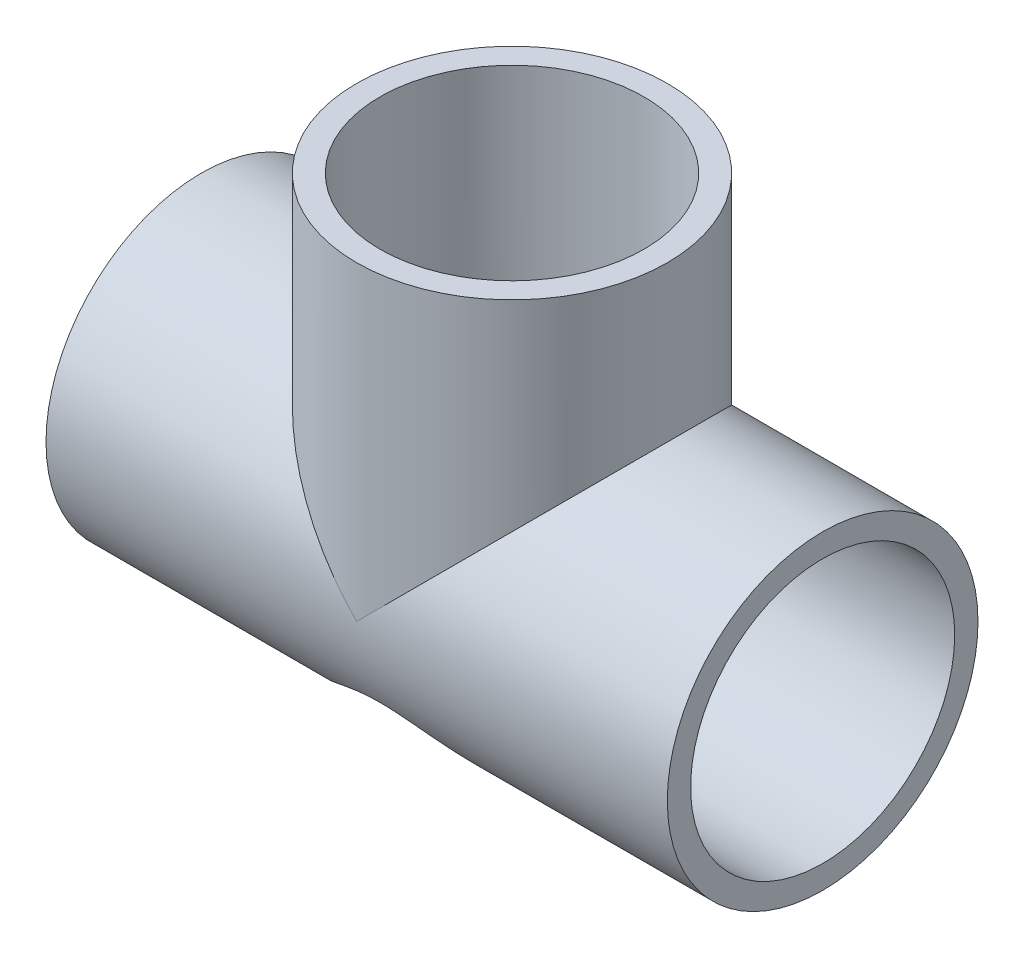
ISO-10303-21;
HEADER;
FILE_DESCRIPTION(('STEP AP214'),'2;1');
FILE_NAME('part.step','',(''),(''),'','','');
FILE_SCHEMA(('AUTOMOTIVE_DESIGN { 1 0 10303 214 1 1 1 1 }'));
ENDSEC;
DATA;
#1=APPLICATION_CONTEXT('core data for automotive mechanical design processes');
#2=APPLICATION_PROTOCOL_DEFINITION('international standard','automotive_design',2000,#1);
#3=PRODUCT_CONTEXT('',#1,'mechanical');
#4=PRODUCT('Part','Part','',(#3));
#5=PRODUCT_RELATED_PRODUCT_CATEGORY('part','',(#4));
#6=PRODUCT_DEFINITION_FORMATION('','',#4);
#7=PRODUCT_DEFINITION_CONTEXT('part definition',#1,'design');
#8=PRODUCT_DEFINITION('design','',#6,#7);
#9=PRODUCT_DEFINITION_SHAPE('','',#8);
#10=(LENGTH_UNIT() NAMED_UNIT(*) SI_UNIT(.MILLI.,.METRE.));
#11=(NAMED_UNIT(*) PLANE_ANGLE_UNIT() SI_UNIT($,.RADIAN.));
#12=(NAMED_UNIT(*) SI_UNIT($,.STERADIAN.) SOLID_ANGLE_UNIT());
#13=UNCERTAINTY_MEASURE_WITH_UNIT(LENGTH_MEASURE(1.E-05),#10,'distance_accuracy_value','');
#14=(GEOMETRIC_REPRESENTATION_CONTEXT(3) GLOBAL_UNCERTAINTY_ASSIGNED_CONTEXT((#13)) GLOBAL_UNIT_ASSIGNED_CONTEXT((#10,
#11,#12)) REPRESENTATION_CONTEXT('',''));
#15=CARTESIAN_POINT('',(0.,0.,0.));
#16=DIRECTION('',(0.,0.,1.));
#17=DIRECTION('',(1.,0.,0.));
#18=AXIS2_PLACEMENT_3D('',#15,#16,#17);
#19=CARTESIAN_POINT('',(50.,0.,0.));
#20=DIRECTION('',(-1.,0.,0.));
#21=DIRECTION('',(0.,0.,1.));
#22=AXIS2_PLACEMENT_3D('',#19,#20,#21);
#23=CYLINDRICAL_SURFACE('',#22,42.5);
#24=CARTESIAN_POINT('',(0.,0.,0.));
#25=DIRECTION('',(-0.707106781186547,0.707106781186547,0.));
#26=DIRECTION('',(-0.707106781186547,-0.707106781186547,0.));
#27=AXIS2_PLACEMENT_3D('',#24,#25,#26);
#28=ELLIPSE('',#27,60.1040764008565,42.5);
#29=CARTESIAN_POINT('',(0.,0.,-42.5));
#30=VERTEX_POINT('',#29);
#31=CARTESIAN_POINT('',(0.,0.,42.5));
#32=VERTEX_POINT('',#31);
#33=EDGE_CURVE('E65',#30,#32,#28,.F.);
#34=ORIENTED_EDGE('',*,*,#33,.F.);
#35=CARTESIAN_POINT('',(0.,0.,0.));
#36=DIRECTION('',(-0.707106781186547,-0.707106781186547,0.));
#37=DIRECTION('',(-0.707106781186547,0.707106781186547,0.));
#38=AXIS2_PLACEMENT_3D('',#35,#36,#37);
#39=ELLIPSE('',#38,60.1040764008565,42.5);
#40=EDGE_CURVE('E87',#32,#30,#39,.F.);
#41=ORIENTED_EDGE('',*,*,#40,.F.);
#42=EDGE_LOOP('',(#34,#41));
#43=FACE_BOUND('',#42,.T.);
#44=CARTESIAN_POINT('',(100.,0.,0.));
#45=DIRECTION('',(1.,0.,0.));
#46=DIRECTION('',(0.,0.,-1.));
#47=AXIS2_PLACEMENT_3D('',#44,#45,#46);
#48=CIRCLE('',#47,42.5);
#49=CARTESIAN_POINT('',(100.,0.,-42.5));
#50=VERTEX_POINT('',#49);
#51=EDGE_CURVE('E108',#50,#50,#48,.T.);
#52=ORIENTED_EDGE('',*,*,#51,.T.);
#53=EDGE_LOOP('',(#52));
#54=FACE_BOUND('',#53,.T.);
#55=ADVANCED_FACE('F44',(#43,#54),#23,.F.);
#56=CARTESIAN_POINT('',(100.,0.,0.));
#57=DIRECTION('',(1.,0.,0.));
#58=DIRECTION('',(0.,0.,-1.));
#59=AXIS2_PLACEMENT_3D('',#56,#57,#58);
#60=PLANE('',#59);
#61=CARTESIAN_POINT('',(100.,0.,0.));
#62=DIRECTION('',(1.,0.,0.));
#63=DIRECTION('',(0.,0.,-1.));
#64=AXIS2_PLACEMENT_3D('',#61,#62,#63);
#65=CIRCLE('',#64,50.);
#66=CARTESIAN_POINT('',(100.,0.,-50.));
#67=VERTEX_POINT('',#66);
#68=EDGE_CURVE('E12',#67,#67,#65,.T.);
#69=ORIENTED_EDGE('',*,*,#68,.T.);
#70=EDGE_LOOP('',(#69));
#71=FACE_BOUND('',#70,.T.);
#72=ORIENTED_EDGE('',*,*,#51,.F.);
#73=EDGE_LOOP('',(#72));
#74=FACE_BOUND('',#73,.T.);
#75=ADVANCED_FACE('F124',(#71,#74),#60,.T.);
#76=CARTESIAN_POINT('',(0.,0.,0.));
#77=DIRECTION('',(-0.707106781186547,-0.707106781186547,0.));
#78=DIRECTION('',(-0.707106781186547,0.707106781186547,0.));
#79=AXIS2_PLACEMENT_3D('',#76,#77,#78);
#80=ELLIPSE('',#79,60.1040764008565,42.5);
#81=EDGE_CURVE('E77',#32,#30,#80,.T.);
#82=ORIENTED_EDGE('',*,*,#81,.F.);
#83=CARTESIAN_POINT('',(0.,0.,0.));
#84=DIRECTION('',(-0.707106781186547,0.707106781186547,0.));
#85=DIRECTION('',(-0.707106781186547,-0.707106781186547,0.));
#86=AXIS2_PLACEMENT_3D('',#83,#84,#85);
#87=ELLIPSE('',#86,60.1040764008565,42.5);
#88=EDGE_CURVE('E92',#30,#32,#87,.T.);
#89=ORIENTED_EDGE('',*,*,#88,.F.);
#90=EDGE_LOOP('',(#82,#89));
#91=FACE_BOUND('',#90,.T.);
#92=CARTESIAN_POINT('',(-100.,0.,0.));
#93=DIRECTION('',(1.,0.,0.));
#94=DIRECTION('',(0.,0.,-1.));
#95=AXIS2_PLACEMENT_3D('',#92,#93,#94);
#96=CIRCLE('',#95,42.5);
#97=CARTESIAN_POINT('',(-100.,0.,-42.5));
#98=VERTEX_POINT('',#97);
#99=EDGE_CURVE('E107',#98,#98,#96,.T.);
#100=ORIENTED_EDGE('',*,*,#99,.F.);
#101=EDGE_LOOP('',(#100));
#102=FACE_BOUND('',#101,.T.);
#103=ADVANCED_FACE('F94',(#91,#102),#23,.F.);
#104=CARTESIAN_POINT('',(50.,0.,0.));
#105=DIRECTION('',(-1.,0.,0.));
#106=DIRECTION('',(0.,0.,1.));
#107=AXIS2_PLACEMENT_3D('',#104,#105,#106);
#108=CYLINDRICAL_SURFACE('',#107,50.);
#109=CARTESIAN_POINT('',(0.,-26.3391343821318,42.5));
#110=CARTESIAN_POINT('',(0.725211898185081,-26.3391567870329,42.49999202719));
#111=CARTESIAN_POINT('',(1.45065802858549,-26.369250982345,42.481381140812));
#112=CARTESIAN_POINT('',(2.89514111491192,-26.4879715036844,42.4074522279962));
#113=CARTESIAN_POINT('',(3.61417335527075,-26.5766377906554,42.3521091408081));
#114=CARTESIAN_POINT('',(5.04194475430984,-26.8080826373791,42.2059870066493));
#115=CARTESIAN_POINT('',(5.75064667521772,-26.951022322171,42.1151024209827));
#116=CARTESIAN_POINT('',(7.15144524385325,-27.2842427356274,41.8999916045213));
#117=CARTESIAN_POINT('',(7.84354184378451,-27.4745236005398,41.7757652777691));
#118=CARTESIAN_POINT('',(9.4881701775968,-27.9810219082791,41.4389745473066));
#119=CARTESIAN_POINT('',(10.431496995776,-28.316922062192,41.2110583301054));
#120=CARTESIAN_POINT('',(12.2789247409494,-29.0482525141808,40.6988723609985));
#121=CARTESIAN_POINT('',(13.1830035898208,-29.4437157732638,40.4145713791465));
#122=CARTESIAN_POINT('',(14.9549125892595,-30.2784938574265,39.7930197782754));
#123=CARTESIAN_POINT('',(15.8226361338149,-30.7179263695507,39.4556255918315));
#124=CARTESIAN_POINT('',(17.5209659427935,-31.6262457688377,38.7313567044281));
#125=CARTESIAN_POINT('',(18.3515745512784,-32.0951307913611,38.3444851342802));
#126=CARTESIAN_POINT('',(19.7730147087391,-32.9314529376963,37.6263533230709));
#127=CARTESIAN_POINT('',(20.3716279955444,-33.2947580077124,37.3055650933665));
#128=CARTESIAN_POINT('',(21.5496984303852,-34.028325769708,36.637672533246));
#129=CARTESIAN_POINT('',(22.1291538997985,-34.3985890669379,36.2905659055217));
#130=CARTESIAN_POINT('',(23.2694311912268,-35.142992222961,35.5701916175696));
#131=CARTESIAN_POINT('',(23.8302449680472,-35.5171336663673,35.1969128728891));
#132=CARTESIAN_POINT('',(24.9330930474468,-36.2663124365689,34.424469371275));
#133=CARTESIAN_POINT('',(25.4751279147959,-36.6413497360585,34.0253053938706));
#134=CARTESIAN_POINT('',(26.5398454748341,-37.3894374851881,33.2014939035382));
#135=CARTESIAN_POINT('',(27.062546142398,-37.7624894893867,32.7768710740929));
#136=CARTESIAN_POINT('',(28.0887639575677,-38.5045873246054,31.9018193444586));
#137=CARTESIAN_POINT('',(28.592280716354,-38.8736330743184,31.4513899216842));
#138=CARTESIAN_POINT('',(30.072962154608,-39.971149680218,30.0615927816757));
#139=CARTESIAN_POINT('',(31.0209379043143,-40.6904825615714,29.0831912165929));
#140=CARTESIAN_POINT('',(32.6324958609711,-41.9336241111924,27.2491360598047));
#141=CARTESIAN_POINT('',(33.3128286487028,-42.4656926210775,26.4136791370192));
#142=CARTESIAN_POINT('',(34.6168825161168,-43.4961922986432,24.6799050109747));
#143=CARTESIAN_POINT('',(35.2406055445616,-43.9946246240808,23.7815899734614));
#144=CARTESIAN_POINT('',(36.4248597940039,-44.9488345037011,21.9246577396795));
#145=CARTESIAN_POINT('',(36.9854746295884,-45.4046683589259,20.9661230199537));
#146=CARTESIAN_POINT('',(38.0377664584819,-46.2658650929625,18.9902694212451));
#147=CARTESIAN_POINT('',(38.5294565193346,-46.6712375371869,17.9729617368978));
#148=CARTESIAN_POINT('',(39.3556052405926,-47.3557838130623,16.0705163175456));
#149=CARTESIAN_POINT('',(39.7024628772922,-47.6445675362484,15.1942059761239));
#150=CARTESIAN_POINT('',(40.3405954387533,-48.1776177059569,13.4083955748443));
#151=CARTESIAN_POINT('',(40.6318762963514,-48.4218889040784,12.49889906998));
#152=CARTESIAN_POINT('',(41.1547400114881,-48.8614632538528,10.6516817677908));
#153=CARTESIAN_POINT('',(41.3863465421954,-49.0567858228807,9.71397232808962));
#154=CARTESIAN_POINT('',(41.7864145219108,-49.3947666434327,7.81576859904049));
#155=CARTESIAN_POINT('',(41.9548752575555,-49.5374242999966,6.85527405241763));
#156=CARTESIAN_POINT('',(42.2264003646234,-49.7675965456939,4.91387435973801));
#157=CARTESIAN_POINT('',(42.3291566876643,-49.8548513712102,3.93289501910159));
#158=CARTESIAN_POINT('',(42.4661376801712,-49.9712070851266,1.96270105527905));
#159=CARTESIAN_POINT('',(42.5003622039592,-50.0003078499085,0.973486414591638));
#160=CARTESIAN_POINT('',(42.4996320166524,-49.9996872376098,-1.00483120147058));
#161=CARTESIAN_POINT('',(42.4646816586565,-49.9699695619086,-1.99393417995504));
#162=CARTESIAN_POINT('',(42.3262693369479,-49.8523995280878,-3.96380274493936));
#163=CARTESIAN_POINT('',(42.2228101816942,-49.7645495530518,-4.94456867154023));
#164=CARTESIAN_POINT('',(41.9594490098244,-49.5413048921935,-6.81776511784512));
#165=CARTESIAN_POINT('',(41.8043021651976,-49.4099195871217,-7.71135236940262));
#166=CARTESIAN_POINT('',(41.4392383856868,-49.1014353088852,-9.47913792485673));
#167=CARTESIAN_POINT('',(41.229324780101,-48.9243391145146,-10.3533374038417));
#168=CARTESIAN_POINT('',(40.757565434374,-48.5274446914428,-12.0776642031425));
#169=CARTESIAN_POINT('',(40.4957174461572,-48.3076446142333,-12.9277904795843));
#170=CARTESIAN_POINT('',(39.923283784079,-47.8287988339707,-14.6000906802508));
#171=CARTESIAN_POINT('',(39.6126950729873,-47.5697506852473,-15.4222628586563));
#172=CARTESIAN_POINT('',(38.9197371240195,-46.9942101407361,-17.0994508872366));
#173=CARTESIAN_POINT('',(38.5336326593327,-46.6747942245017,-17.9519175680478));
#174=CARTESIAN_POINT('',(37.7127222306685,-45.9994019360847,-19.6179289314817));
#175=CARTESIAN_POINT('',(37.2779150077208,-45.6434246188068,-20.4314726071653));
#176=CARTESIAN_POINT('',(36.3632845260253,-44.899527998887,-22.0181885406348));
#177=CARTESIAN_POINT('',(35.8834371077212,-44.5115915671832,-22.7913387812874));
#178=CARTESIAN_POINT('',(34.8823696260805,-43.7085841448695,-24.2958207993424));
#179=CARTESIAN_POINT('',(34.361141269158,-43.2935077178054,-25.0271441429945));
#180=CARTESIAN_POINT('',(33.416642636474,-42.5483293645983,-26.268299050259));
#181=CARTESIAN_POINT('',(33.0017635065046,-42.2231551552569,-26.7875255652406));
#182=CARTESIAN_POINT('',(32.1518352665696,-41.5622339828823,-27.8019291575287));
#183=CARTESIAN_POINT('',(31.7167894430468,-41.2264887453858,-28.2971101266479));
#184=CARTESIAN_POINT('',(30.3822288043898,-40.2057187820271,-29.7472195534696));
#185=CARTESIAN_POINT('',(29.4535282533305,-39.5073484088781,-30.6664039595332));
#186=CARTESIAN_POINT('',(28.0061195868321,-38.4445805118311,-31.9739132484867));
#187=CARTESIAN_POINT('',(27.5140235862826,-38.0873910255745,-32.3982958551341));
#188=CARTESIAN_POINT('',(26.5121469727369,-37.3700612589591,-33.2231403888845));
#189=CARTESIAN_POINT('',(26.0023663224174,-37.0099209723737,-33.6236022654984));
#190=CARTESIAN_POINT('',(24.9655599357227,-36.2889842518412,-34.4004412261207));
#191=CARTESIAN_POINT('',(24.4385395152383,-35.9281880519559,-34.7768256305754));
#192=CARTESIAN_POINT('',(23.3671558350968,-35.2081915854682,-35.5055725362412));
#193=CARTESIAN_POINT('',(22.8227932949242,-34.8489912533595,-35.8579360321248));
#194=CARTESIAN_POINT('',(21.4165769994772,-33.9410418734411,-36.7230701149706));
#195=CARTESIAN_POINT('',(20.5425925982025,-33.3951035521651,-37.2192408040975));
#196=CARTESIAN_POINT('',(18.7513486999347,-32.3241008168695,-38.1530762449519));
#197=CARTESIAN_POINT('',(17.8340837751267,-31.7990390362752,-38.5907336319949));
#198=CARTESIAN_POINT('',(15.9562982362045,-30.7852234810835,-39.4042026688978));
#199=CARTESIAN_POINT('',(14.9958884669771,-30.2963843541066,-39.7801624165211));
#200=CARTESIAN_POINT('',(13.0275354827318,-29.3719681384752,-40.4675024172834));
#201=CARTESIAN_POINT('',(12.0196210805723,-28.9363593258776,-40.7789212130181));
#202=CARTESIAN_POINT('',(10.3439557145622,-28.2912580675237,-41.22737330008));
#203=CARTESIAN_POINT('',(9.69093604907316,-28.0583639961654,-41.3859286484039));
#204=CARTESIAN_POINT('',(8.36665907190421,-27.62894821709,-41.6738285056251));
#205=CARTESIAN_POINT('',(7.69540403217541,-27.4324220019082,-41.8031766349296));
#206=CARTESIAN_POINT('',(6.33785717484376,-27.0830108285203,-42.030394103654));
#207=CARTESIAN_POINT('',(5.65160105771351,-26.9300323092879,-42.128330987552));
#208=CARTESIAN_POINT('',(4.26590474000412,-26.6736701871987,-42.2911162907257));
#209=CARTESIAN_POINT('',(3.56646502208576,-26.5702847723552,-42.3559659189185));
#210=CARTESIAN_POINT('',(2.15242034465923,-26.4175025999415,-42.4514299444122));
#211=CARTESIAN_POINT('',(1.43773415717399,-26.3686370331601,-42.4817075697319));
#212=CARTESIAN_POINT('',(0.00615136623367753,-26.3294161130181,-42.5060279842829));
#213=CARTESIAN_POINT('',(-0.710745128930647,-26.3390579373119,-42.5000725213668));
#214=CARTESIAN_POINT('',(-2.14078153704913,-26.4163323437918,-42.452083402804));
#215=CARTESIAN_POINT('',(-2.85391754601739,-26.4840164468586,-42.4100176940802));
#216=CARTESIAN_POINT('',(-4.26992687958348,-26.6737596468692,-42.2909317734936));
#217=CARTESIAN_POINT('',(-4.97279848506087,-26.7958277467838,-42.2139057741078));
#218=CARTESIAN_POINT('',(-6.50427300430854,-27.1180324641161,-42.0078069029186));
#219=CARTESIAN_POINT('',(-7.32960393125462,-27.3289561895003,-41.8713648897852));
#220=CARTESIAN_POINT('',(-8.95438297941609,-27.8087643753638,-41.5542413155113));
#221=CARTESIAN_POINT('',(-9.75382342007044,-28.0776658573611,-41.3735467602768));
#222=CARTESIAN_POINT('',(-11.3272607134559,-28.6621975768578,-40.9707784725425));
#223=CARTESIAN_POINT('',(-12.101176405718,-28.9779620428063,-40.7485853881157));
#224=CARTESIAN_POINT('',(-13.6211933066007,-29.6449029811948,-40.2659793295917));
#225=CARTESIAN_POINT('',(-14.3672932256745,-29.9960810926316,-40.0055645862844));
#226=CARTESIAN_POINT('',(-15.7022016528223,-30.6600120979057,-39.4981770358435));
#227=CARTESIAN_POINT('',(-16.2953898171529,-30.9684949224438,-39.2570470093091));
#228=CARTESIAN_POINT('',(-17.4642494356835,-31.5991743843371,-38.7512010003305));
#229=CARTESIAN_POINT('',(-18.0399185764767,-31.9213728194945,-38.4864819208992));
#230=CARTESIAN_POINT('',(-19.1745162596745,-32.5760237183624,-37.9339724085412));
#231=CARTESIAN_POINT('',(-19.7334362426737,-32.9084812544515,-37.6461704466075));
#232=CARTESIAN_POINT('',(-20.8347009433216,-33.5804182306701,-37.0480478387521));
#233=CARTESIAN_POINT('',(-21.3770463073058,-33.9198973961199,-36.7377280725197));
#234=CARTESIAN_POINT('',(-22.446225341114,-34.6036688979488,-36.0944136137705));
#235=CARTESIAN_POINT('',(-22.9730384288131,-34.9479668012692,-35.7613906148613));
#236=CARTESIAN_POINT('',(-24.0106109926051,-35.6385992931125,-35.0731820671506));
#237=CARTESIAN_POINT('',(-24.5213690563353,-35.9849340576548,-34.7179945766947));
#238=CARTESIAN_POINT('',(-26.0293996788265,-37.0235990062251,-33.6194528522282));
#239=CARTESIAN_POINT('',(-27.0029078170545,-37.7159003146361,-32.842830833227));
#240=CARTESIAN_POINT('',(-28.4334051292401,-38.7568897319731,-31.5945274550086));
#241=CARTESIAN_POINT('',(-28.9145204914289,-39.1113848560584,-31.1548879493205));
#242=CARTESIAN_POINT('',(-29.8583289584808,-39.8141992878545,-30.2515625876018));
#243=CARTESIAN_POINT('',(-30.3210217473151,-40.1625184895642,-29.7878763193767));
#244=CARTESIAN_POINT('',(-31.6806815266242,-41.1954779794769,-28.3603858067069));
#245=CARTESIAN_POINT('',(-32.5492644709392,-41.868145494396,-27.3601198047385));
#246=CARTESIAN_POINT('',(-33.7875812708191,-42.8402380603986,-25.7893875371749));
#247=CARTESIAN_POINT('',(-34.1891734747019,-43.1577769991543,-25.2547361988159));
#248=CARTESIAN_POINT('',(-34.9701812839122,-43.7790756620893,-24.1616947668411));
#249=CARTESIAN_POINT('',(-35.3495982336187,-44.082836221335,-23.603306115857));
#250=CARTESIAN_POINT('',(-36.08466029059,-44.6744355417493,-22.46345749169));
#251=CARTESIAN_POINT('',(-36.4403186514039,-44.9622831641108,-21.8820106747706));
#252=CARTESIAN_POINT('',(-37.1266659032717,-45.5203185694305,-20.6961384579268));
#253=CARTESIAN_POINT('',(-37.4573490182083,-45.7905022652575,-20.0917077907427));
#254=CARTESIAN_POINT('',(-38.209331980641,-46.4073397783906,-18.63320379345));
#255=CARTESIAN_POINT('',(-38.6189747767007,-46.7453677196478,-17.7693999158323));
#256=CARTESIAN_POINT('',(-39.3837109292343,-47.3791188783484,-16.0030892274811));
#257=CARTESIAN_POINT('',(-39.7388189378454,-47.6748534574896,-15.1005928960955));
#258=CARTESIAN_POINT('',(-40.2271267332952,-48.0828844735278,-13.7210184276614));
#259=CARTESIAN_POINT('',(-40.3824927957717,-48.2129572037528,-13.2568940744593));
#260=CARTESIAN_POINT('',(-40.6779215441836,-48.460672980307,-12.3206200155868));
#261=CARTESIAN_POINT('',(-40.8179866702267,-48.5783180084375,-11.848471603467));
#262=CARTESIAN_POINT('',(-41.214468880668,-48.9117765642336,-10.4207772081584));
#263=CARTESIAN_POINT('',(-41.4472101380194,-49.1081448263211,-9.45387698732464));
#264=CARTESIAN_POINT('',(-41.8467576406095,-49.4458255045123,-7.49059037183856));
#265=CARTESIAN_POINT('',(-42.0131373681192,-49.5867816963644,-6.49405611655061));
#266=CARTESIAN_POINT('',(-42.274823220281,-49.8086925474468,-4.48500121323611));
#267=CARTESIAN_POINT('',(-42.3701294872258,-49.8896473268032,-3.47248059721924));
#268=CARTESIAN_POINT('',(-42.4877717703324,-49.9895967930637,-1.4404202232061));
#269=CARTESIAN_POINT('',(-42.5101268817191,-50.0086076939968,-0.420882372026607));
#270=CARTESIAN_POINT('',(-42.4814657068749,-49.9842461043991,1.61636941960762));
#271=CARTESIAN_POINT('',(-42.4304545500731,-49.9408779751207,2.63408348259234));
#272=CARTESIAN_POINT('',(-42.2644868522239,-49.799951518048,4.56149325715831));
#273=CARTESIAN_POINT('',(-42.156136689029,-49.7079930122912,5.47218243657871));
#274=CARTESIAN_POINT('',(-41.8820620366578,-49.4757699988946,7.2785491093447));
#275=CARTESIAN_POINT('',(-41.7163419707295,-49.3355092153889,8.17422775442993));
#276=CARTESIAN_POINT('',(-41.3299465782635,-49.0092214101885,9.94520817375584));
#277=CARTESIAN_POINT('',(-41.1092644815567,-48.823188750393,10.8205074231474));
#278=CARTESIAN_POINT('',(-40.615928621121,-48.408530290623,12.5459816658438));
#279=CARTESIAN_POINT('',(-40.3432719155048,-48.1799020796547,13.396155233827));
#280=CARTESIAN_POINT('',(-39.7361078885429,-47.6726253593904,15.1046251270546));
#281=CARTESIAN_POINT('',(-39.3993938894883,-47.3922082247615,15.9616096541444));
#282=CARTESIAN_POINT('',(-38.6767681021315,-46.7931784938851,17.640665992899));
#283=CARTESIAN_POINT('',(-38.2908562807174,-46.4745658719305,18.4627377810657));
#284=CARTESIAN_POINT('',(-37.4736339841297,-45.8035896422094,20.0696124575562));
#285=CARTESIAN_POINT('',(-37.0423226671689,-45.4512254086389,20.854414654444));
#286=CARTESIAN_POINT('',(-36.1377633063862,-44.7170893315292,22.3853242087129));
#287=CARTESIAN_POINT('',(-35.6645067430921,-44.3353115158841,23.131423656195));
#288=CARTESIAN_POINT('',(-34.8069552617418,-43.6488978567156,24.3956699338297));
#289=CARTESIAN_POINT('',(-34.4313539137018,-43.3498830997508,24.9228194589079));
#290=CARTESIAN_POINT('',(-33.6601703749403,-42.7399286082551,25.9549194851765));
#291=CARTESIAN_POINT('',(-33.2645915883129,-42.428990907516,26.4598737411293));
#292=CARTESIAN_POINT('',(-32.0489831990386,-41.4804718930311,27.9418324819519));
#293=CARTESIAN_POINT('',(-31.2002636304257,-40.8273312425281,28.8856659211805));
#294=CARTESIAN_POINT('',(-29.4300132614882,-39.4909759441239,30.6875625830755));
#295=CARTESIAN_POINT('',(-28.5082129416461,-38.8076545214642,31.5452791051794));
#296=CARTESIAN_POINT('',(-26.5986210894328,-37.4272663313325,33.1713095187298));
#297=CARTESIAN_POINT('',(-25.6108416800391,-36.7302021054585,33.9396397632415));
#298=CARTESIAN_POINT('',(-24.0708806614848,-35.6793166308057,35.0321130764176));
#299=CARTESIAN_POINT('',(-23.5424487140743,-35.324688518717,35.3894162569374));
#300=CARTESIAN_POINT('',(-22.4686298633804,-34.6182836218654,36.0807218997926));
#301=CARTESIAN_POINT('',(-21.9232427815628,-34.2665068671759,36.4147241166533));
#302=CARTESIAN_POINT('',(-20.814968296215,-33.568253293664,37.0593891072252));
#303=CARTESIAN_POINT('',(-20.2520704643894,-33.2217798237414,37.3700375815984));
#304=CARTESIAN_POINT('',(-19.1086550998556,-32.5373770819704,37.9674250983888));
#305=CARTESIAN_POINT('',(-18.5281379078056,-32.1994476451604,38.2541646026682));
#306=CARTESIAN_POINT('',(-17.3514757723236,-31.5370934716033,38.8020053655309));
#307=CARTESIAN_POINT('',(-16.7554101659497,-31.212616194281,39.0632131401482));
#308=CARTESIAN_POINT('',(-15.5445236816979,-30.579662664646,39.5606653793389));
#309=CARTESIAN_POINT('',(-14.9297011546376,-30.2711878258074,39.7969076406466));
#310=CARTESIAN_POINT('',(-13.6815041580523,-29.675464031887,40.2430756882552));
#311=CARTESIAN_POINT('',(-13.048153997333,-29.3881888654026,40.4530342035703));
#312=CARTESIAN_POINT('',(-11.7619343243355,-28.8401588912089,40.8455483028262));
#313=CARTESIAN_POINT('',(-11.1090708664708,-28.5793959658078,41.0281122828021));
#314=CARTESIAN_POINT('',(-9.78693927551322,-28.0919656698244,41.3633725437838));
#315=CARTESIAN_POINT('',(-9.11776642575042,-27.8651385650101,41.5162098379108));
#316=CARTESIAN_POINT('',(-7.76089967966275,-27.451128206488,41.79111655356));
#317=CARTESIAN_POINT('',(-7.07320526528268,-27.2639460629654,41.9131851134778));
#318=CARTESIAN_POINT('',(-5.68422212804308,-26.9370866404627,42.123997451878));
#319=CARTESIAN_POINT('',(-4.98299309814933,-26.7972362066439,42.2128628253365));
#320=CARTESIAN_POINT('',(-3.56875441231927,-26.5706603613261,42.3558525219935));
#321=CARTESIAN_POINT('',(-2.85575331902352,-26.4838979444878,42.4100010460543));
#322=CARTESIAN_POINT('',(-1.78417023354836,-26.3971068151969,42.4640285121736));
#323=CARTESIAN_POINT('',(-1.42788899092118,-26.3754030115525,42.4775048772527));
#324=CARTESIAN_POINT('',(-0.714424250697311,-26.3464094193589,42.4954937399126));
#325=CARTESIAN_POINT('',(-0.357240544314731,-26.3391233454416,42.500003927419));
#326=CARTESIAN_POINT('',(0.,-26.3391343821318,42.5));
#327=B_SPLINE_CURVE_WITH_KNOTS('',3,(#109,#110,#111,#112,#113,#114,#115,#116,#117,#118,#119,
#120,#121,#122,#123,#124,#125,#126,#127,#128,#129,#130,#131,#132,#133,#134,#135,#136,#137,#138,
#139,#140,#141,#142,#143,#144,#145,#146,#147,#148,#149,#150,#151,#152,#153,#154,#155,#156,#157,
#158,#159,#160,#161,#162,#163,#164,#165,#166,#167,#168,#169,#170,#171,#172,#173,#174,#175,#176,
#177,#178,#179,#180,#181,#182,#183,#184,#185,#186,#187,#188,#189,#190,#191,#192,#193,#194,#195,
#196,#197,#198,#199,#200,#201,#202,#203,#204,#205,#206,#207,#208,#209,#210,#211,#212,#213,#214,
#215,#216,#217,#218,#219,#220,#221,#222,#223,#224,#225,#226,#227,#228,#229,#230,#231,#232,#233,
#234,#235,#236,#237,#238,#239,#240,#241,#242,#243,#244,#245,#246,#247,#248,#249,#250,#251,#252,
#253,#254,#255,#256,#257,#258,#259,#260,#261,#262,#263,#264,#265,#266,#267,#268,#269,#270,#271,
#272,#273,#274,#275,#276,#277,#278,#279,#280,#281,#282,#283,#284,#285,#286,#287,#288,#289,#290,
#291,#292,#293,#294,#295,#296,#297,#298,#299,#300,#301,#302,#303,#304,#305,#306,#307,#308,#309,
#310,#311,#312,#313,#314,#315,#316,#317,#318,#319,#320,#321,#322,#323,#324,#325,#326),
.UNSPECIFIED.,.T.,.F.,(4,2,2,2,2,2,2,2,2,2,2,2,2,2,2,2,2,2,2,2,2,2,2,2,2,2,2,2,2,2,2,2,2,2,2,2,
2,2,2,2,2,2,2,2,2,2,2,2,2,2,2,2,2,2,2,2,2,2,2,2,2,2,2,2,2,2,2,2,2,2,2,2,2,2,2,2,2,2,2,2,2,2,2,2,
2,2,2,2,2,2,2,2,2,2,2,2,2,2,2,2,2,2,2,2,2,2,2,2,4),(0.,2.17520384220486,4.35189325703995,
6.53509593048604,8.71830488725958,11.7940767565987,14.871556991776,17.9575066428862,
21.0432611189444,23.3532200897023,25.6633809272465,27.9745261473531,30.2856018000271,
32.5944719024377,34.9033887761676,39.5182757896828,43.1201918382526,46.721983845611,
50.3189460839266,53.9152254441635,56.8694752663647,59.8234095449236,62.776170169212,
65.7289641500821,68.6955024136224,71.6620469831288,74.6284048772025,77.5946411755229,
80.3408859161485,83.0869637501025,85.8331604790638,88.5795284025737,91.5432167370464,
94.5069817007953,97.4723456130832,100.438305352567,102.657266577554,104.875867454589,
109.314367057539,111.538476442352,113.762590521413,115.986025141336,118.209367635916,
121.638051028782,125.067165562024,128.487924552815,131.90663480911,134.038782939377,
136.170666632045,138.297934852944,140.425125343769,142.57286498439,144.720501020744,
146.870045368926,149.019945694616,151.603986414655,154.188786811096,156.781139017151,
159.373611256276,161.505131869662,163.636932742073,165.769805077656,167.902594134425,
170.038092783487,172.17377876991,176.44323638136,178.668406864307,180.893615502346,
185.343876263825,187.563959272716,189.783907548741,192.002606919594,194.221817855863,
197.260907218655,200.29917862002,201.818067272626,203.336713346683,206.373659183463,
209.42982110184,212.485976901604,215.541332677503,218.596474847489,221.358426861613,
224.120165975267,226.882245445639,229.644481302775,232.529214804238,235.413950247242,
238.298739187782,241.184115404604,243.322398840321,245.460319140466,249.737220612543,
254.030702829937,258.323398322827,260.512457390678,262.701539516696,264.891951266783,
267.082320693721,269.263122681559,271.44411696988,273.622367842336,275.799949742308,
277.966935556677,280.133982045537,282.293012841659,284.450536952066,285.521769893739,
286.593278795523),.UNSPECIFIED.);
#328=CARTESIAN_POINT('',(0.,-26.3391343821318,42.5));
#329=VERTEX_POINT('',#328);
#330=EDGE_CURVE('E49',#329,#329,#327,.T.);
#331=ORIENTED_EDGE('',*,*,#330,.T.);
#332=EDGE_LOOP('',(#331));
#333=FACE_BOUND('',#332,.T.);
#334=CARTESIAN_POINT('',(0.,0.,0.));
#335=DIRECTION('',(0.707106781186547,0.707106781186547,0.));
#336=DIRECTION('',(-0.707106781186547,0.707106781186547,0.));
#337=AXIS2_PLACEMENT_3D('',#334,#335,#336);
#338=ELLIPSE('',#337,70.7106781186548,50.);
#339=CARTESIAN_POINT('',(0.,0.,-50.));
#340=VERTEX_POINT('',#339);
#341=CARTESIAN_POINT('',(0.,0.,50.));
#342=VERTEX_POINT('',#341);
#343=EDGE_CURVE('E103',#340,#342,#338,.T.);
#344=ORIENTED_EDGE('',*,*,#343,.F.);
#345=CARTESIAN_POINT('',(0.,0.,0.));
#346=DIRECTION('',(-0.707106781186547,0.707106781186547,0.));
#347=DIRECTION('',(0.707106781186547,0.707106781186547,0.));
#348=AXIS2_PLACEMENT_3D('',#345,#346,#347);
#349=ELLIPSE('',#348,70.7106781186548,50.);
#350=EDGE_CURVE('E72',#342,#340,#349,.T.);
#351=ORIENTED_EDGE('',*,*,#350,.F.);
#352=EDGE_LOOP('',(#344,#351));
#353=FACE_BOUND('',#352,.T.);
#354=CARTESIAN_POINT('',(-100.,0.,0.));
#355=DIRECTION('',(1.,0.,0.));
#356=DIRECTION('',(0.,0.,-1.));
#357=AXIS2_PLACEMENT_3D('',#354,#355,#356);
#358=CIRCLE('',#357,50.);
#359=CARTESIAN_POINT('',(-100.,0.,-50.));
#360=VERTEX_POINT('',#359);
#361=EDGE_CURVE('E58',#360,#360,#358,.T.);
#362=ORIENTED_EDGE('',*,*,#361,.T.);
#363=EDGE_LOOP('',(#362));
#364=FACE_BOUND('',#363,.T.);
#365=ORIENTED_EDGE('',*,*,#68,.F.);
#366=EDGE_LOOP('',(#365));
#367=FACE_BOUND('',#366,.T.);
#368=ADVANCED_FACE('F46',(#333,#353,#364,#367),#108,.T.);
#369=CARTESIAN_POINT('',(-100.,0.,0.));
#370=DIRECTION('',(1.,0.,0.));
#371=DIRECTION('',(0.,0.,-1.));
#372=AXIS2_PLACEMENT_3D('',#369,#370,#371);
#373=PLANE('',#372);
#374=ORIENTED_EDGE('',*,*,#361,.F.);
#375=EDGE_LOOP('',(#374));
#376=FACE_BOUND('',#375,.T.);
#377=ORIENTED_EDGE('',*,*,#99,.T.);
#378=EDGE_LOOP('',(#377));
#379=FACE_BOUND('',#378,.T.);
#380=ADVANCED_FACE('F117',(#376,#379),#373,.F.);
#381=CARTESIAN_POINT('',(0.,100.,0.));
#382=DIRECTION('',(0.,1.,0.));
#383=DIRECTION('',(0.,0.,1.));
#384=AXIS2_PLACEMENT_3D('',#381,#382,#383);
#385=PLANE('',#384);
#386=CARTESIAN_POINT('',(0.,100.,0.));
#387=DIRECTION('',(0.,1.,0.));
#388=DIRECTION('',(0.,0.,1.));
#389=AXIS2_PLACEMENT_3D('',#386,#387,#388);
#390=CIRCLE('',#389,42.5);
#391=CARTESIAN_POINT('',(0.,100.,42.5));
#392=VERTEX_POINT('',#391);
#393=EDGE_CURVE('E99',#392,#392,#390,.T.);
#394=ORIENTED_EDGE('',*,*,#393,.F.);
#395=EDGE_LOOP('',(#394));
#396=FACE_BOUND('',#395,.T.);
#397=CARTESIAN_POINT('',(0.,100.,0.));
#398=DIRECTION('',(0.,1.,0.));
#399=DIRECTION('',(0.,0.,1.));
#400=AXIS2_PLACEMENT_3D('',#397,#398,#399);
#401=CIRCLE('',#400,50.);
#402=CARTESIAN_POINT('',(0.,100.,50.));
#403=VERTEX_POINT('',#402);
#404=EDGE_CURVE('E96',#403,#403,#401,.T.);
#405=ORIENTED_EDGE('',*,*,#404,.T.);
#406=EDGE_LOOP('',(#405));
#407=FACE_BOUND('',#406,.T.);
#408=ADVANCED_FACE('F120',(#396,#407),#385,.T.);
#409=CARTESIAN_POINT('',(0.,-50.002,0.));
#410=DIRECTION('',(0.,1.,0.));
#411=DIRECTION('',(0.,0.,1.));
#412=AXIS2_PLACEMENT_3D('',#409,#410,#411);
#413=CYLINDRICAL_SURFACE('',#412,50.);
#414=ORIENTED_EDGE('',*,*,#404,.F.);
#415=EDGE_LOOP('',(#414));
#416=FACE_BOUND('',#415,.T.);
#417=ORIENTED_EDGE('',*,*,#343,.T.);
#418=ORIENTED_EDGE('',*,*,#350,.T.);
#419=EDGE_LOOP('',(#417,#418));
#420=FACE_BOUND('',#419,.T.);
#421=ADVANCED_FACE('F160',(#416,#420),#413,.T.);
#422=CARTESIAN_POINT('',(0.,-50.002,0.));
#423=DIRECTION('',(0.,1.,0.));
#424=DIRECTION('',(0.,0.,1.));
#425=AXIS2_PLACEMENT_3D('',#422,#423,#424);
#426=CYLINDRICAL_SURFACE('',#425,42.5);
#427=ORIENTED_EDGE('',*,*,#393,.T.);
#428=EDGE_LOOP('',(#427));
#429=FACE_BOUND('',#428,.T.);
#430=ORIENTED_EDGE('',*,*,#33,.T.);
#431=ORIENTED_EDGE('',*,*,#81,.T.);
#432=EDGE_LOOP('',(#430,#431));
#433=FACE_BOUND('',#432,.T.);
#434=ADVANCED_FACE('F78',(#429,#433),#426,.F.);
#435=CARTESIAN_POINT('',(0.,-200.,0.));
#436=DIRECTION('',(0.,1.,0.));
#437=DIRECTION('',(0.,0.,1.));
#438=AXIS2_PLACEMENT_3D('',#435,#436,#437);
#439=CYLINDRICAL_SURFACE('',#438,42.5);
#440=ORIENTED_EDGE('',*,*,#88,.T.);
#441=ORIENTED_EDGE('',*,*,#40,.T.);
#442=EDGE_LOOP('',(#440,#441));
#443=FACE_BOUND('',#442,.T.);
#444=ORIENTED_EDGE('',*,*,#330,.F.);
#445=EDGE_LOOP('',(#444));
#446=FACE_BOUND('',#445,.T.);
#447=ADVANCED_FACE('F90',(#443,#446),#439,.F.);
#448=CLOSED_SHELL('',(#55,#75,#103,#368,#380,#408,#421,#434,#447));
#449=MANIFOLD_SOLID_BREP('B2',#448);
#450=ADVANCED_BREP_SHAPE_REPRESENTATION('',(#18,#449),#14);
#451=SHAPE_DEFINITION_REPRESENTATION(#9,#450);
ENDSEC;
END-ISO-10303-21;
